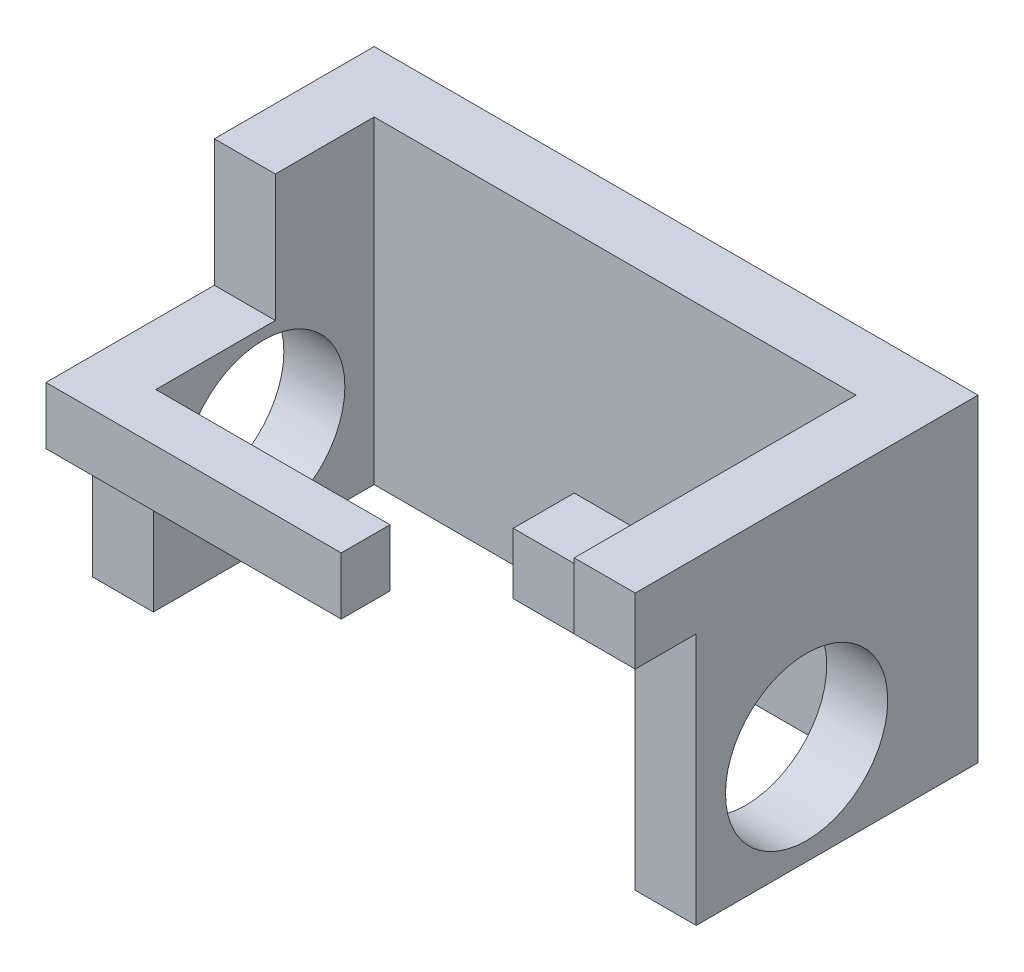
ISO-10303-21;
HEADER;
FILE_DESCRIPTION(('STEP AP214'),'2;1');
FILE_NAME('part.step','',(''),(''),'','','');
FILE_SCHEMA(('AUTOMOTIVE_DESIGN { 1 0 10303 214 1 1 1 1 }'));
ENDSEC;
DATA;
#1=APPLICATION_CONTEXT('core data for automotive mechanical design processes');
#2=APPLICATION_PROTOCOL_DEFINITION('international standard','automotive_design',2000,#1);
#3=PRODUCT_CONTEXT('',#1,'mechanical');
#4=PRODUCT('Part','Part','',(#3));
#5=PRODUCT_RELATED_PRODUCT_CATEGORY('part','',(#4));
#6=PRODUCT_DEFINITION_FORMATION('','',#4);
#7=PRODUCT_DEFINITION_CONTEXT('part definition',#1,'design');
#8=PRODUCT_DEFINITION('design','',#6,#7);
#9=PRODUCT_DEFINITION_SHAPE('','',#8);
#10=(LENGTH_UNIT() NAMED_UNIT(*) SI_UNIT(.MILLI.,.METRE.));
#11=(NAMED_UNIT(*) PLANE_ANGLE_UNIT() SI_UNIT($,.RADIAN.));
#12=(NAMED_UNIT(*) SI_UNIT($,.STERADIAN.) SOLID_ANGLE_UNIT());
#13=UNCERTAINTY_MEASURE_WITH_UNIT(LENGTH_MEASURE(1.E-05),#10,'distance_accuracy_value','');
#14=(GEOMETRIC_REPRESENTATION_CONTEXT(3) GLOBAL_UNCERTAINTY_ASSIGNED_CONTEXT((#13)) GLOBAL_UNIT_ASSIGNED_CONTEXT((#10,
#11,#12)) REPRESENTATION_CONTEXT('',''));
#15=CARTESIAN_POINT('',(0.,0.,0.));
#16=DIRECTION('',(0.,0.,1.));
#17=DIRECTION('',(1.,0.,0.));
#18=AXIS2_PLACEMENT_3D('',#15,#16,#17);
#19=CARTESIAN_POINT('',(-25.3,-45.1648093099041,22.9));
#20=DIRECTION('',(-1.,0.,0.));
#21=DIRECTION('',(0.,0.,1.));
#22=AXIS2_PLACEMENT_3D('',#19,#20,#21);
#23=PLANE('',#22);
#24=DIRECTION('',(0.,0.,1.));
#25=VECTOR('',#24,1.);
#26=CARTESIAN_POINT('',(-25.3,11.,23.1));
#27=LINE('',#26,#25);
#28=CARTESIAN_POINT('',(-25.3,11.,22.9));
#29=VERTEX_POINT('',#28);
#30=CARTESIAN_POINT('',(-25.3,11.,26.9));
#31=VERTEX_POINT('',#30);
#32=EDGE_CURVE('E292',#29,#31,#27,.T.);
#33=ORIENTED_EDGE('',*,*,#32,.F.);
#34=DIRECTION('',(0.,1.,0.));
#35=VECTOR('',#34,1.);
#36=CARTESIAN_POINT('',(-25.3,-45.1648093099041,22.9));
#37=LINE('',#36,#35);
#38=CARTESIAN_POINT('',(-25.3,15.7,22.9));
#39=VERTEX_POINT('',#38);
#40=EDGE_CURVE('E371',#29,#39,#37,.T.);
#41=ORIENTED_EDGE('',*,*,#40,.T.);
#42=DIRECTION('',(0.,0.,-1.));
#43=VECTOR('',#42,1.);
#44=CARTESIAN_POINT('',(-25.3,15.7,26.9));
#45=LINE('',#44,#43);
#46=CARTESIAN_POINT('',(-25.3,15.7,26.9));
#47=VERTEX_POINT('',#46);
#48=EDGE_CURVE('E317',#47,#39,#45,.T.);
#49=ORIENTED_EDGE('',*,*,#48,.F.);
#50=DIRECTION('',(0.,1.,0.));
#51=VECTOR('',#50,1.);
#52=CARTESIAN_POINT('',(-25.3,-45.1648093099041,26.9));
#53=LINE('',#52,#51);
#54=EDGE_CURVE('E353',#31,#47,#53,.T.);
#55=ORIENTED_EDGE('',*,*,#54,.F.);
#56=EDGE_LOOP('',(#33,#41,#49,#55));
#57=FACE_BOUND('',#56,.T.);
#58=ADVANCED_FACE('F39',(#57),#23,.F.);
#59=CARTESIAN_POINT('',(-44.5,-45.1648093099041,22.9));
#60=DIRECTION('',(0.,0.,1.));
#61=DIRECTION('',(1.,0.,0.));
#62=AXIS2_PLACEMENT_3D('',#59,#60,#61);
#63=PLANE('',#62);
#64=DIRECTION('',(-1.,0.,0.));
#65=VECTOR('',#64,1.);
#66=CARTESIAN_POINT('',(0.,11.,22.9));
#67=LINE('',#66,#65);
#68=CARTESIAN_POINT('',(-44.5,11.,22.9));
#69=VERTEX_POINT('',#68);
#70=EDGE_CURVE('E272',#29,#69,#67,.T.);
#71=ORIENTED_EDGE('',*,*,#70,.T.);
#72=DIRECTION('',(0.,1.,0.));
#73=VECTOR('',#72,1.);
#74=CARTESIAN_POINT('',(-44.5,-45.1648093099041,22.9));
#75=LINE('',#74,#73);
#76=CARTESIAN_POINT('',(-44.5,15.7,22.9));
#77=VERTEX_POINT('',#76);
#78=EDGE_CURVE('E359',#69,#77,#75,.T.);
#79=ORIENTED_EDGE('',*,*,#78,.T.);
#80=DIRECTION('',(-1.,0.,0.));
#81=VECTOR('',#80,1.);
#82=CARTESIAN_POINT('',(-25.3,15.7,22.9));
#83=LINE('',#82,#81);
#84=EDGE_CURVE('E321',#39,#77,#83,.T.);
#85=ORIENTED_EDGE('',*,*,#84,.F.);
#86=ORIENTED_EDGE('',*,*,#40,.F.);
#87=EDGE_LOOP('',(#71,#79,#85,#86));
#88=FACE_BOUND('',#87,.T.);
#89=ADVANCED_FACE('F437',(#88),#63,.F.);
#90=CARTESIAN_POINT('',(0.,26.1,26.9));
#91=DIRECTION('',(0.,0.,-1.));
#92=DIRECTION('',(-1.,0.,0.));
#93=AXIS2_PLACEMENT_3D('',#90,#91,#92);
#94=PLANE('',#93);
#95=DIRECTION('',(0.,-1.,0.));
#96=VECTOR('',#95,1.);
#97=CARTESIAN_POINT('',(-49.5,26.1,26.9));
#98=LINE('',#97,#96);
#99=CARTESIAN_POINT('',(-49.5,15.7,26.9));
#100=VERTEX_POINT('',#99);
#101=CARTESIAN_POINT('',(-49.5,11.,26.9));
#102=VERTEX_POINT('',#101);
#103=EDGE_CURVE('E391',#100,#102,#98,.T.);
#104=ORIENTED_EDGE('',*,*,#103,.T.);
#105=DIRECTION('',(-1.,0.,0.));
#106=VECTOR('',#105,1.);
#107=CARTESIAN_POINT('',(-49.5,11.,26.9));
#108=LINE('',#107,#106);
#109=EDGE_CURVE('E276',#31,#102,#108,.T.);
#110=ORIENTED_EDGE('',*,*,#109,.F.);
#111=ORIENTED_EDGE('',*,*,#54,.T.);
#112=DIRECTION('',(1.,0.,0.));
#113=VECTOR('',#112,1.);
#114=CARTESIAN_POINT('',(-49.5,15.7,26.9));
#115=LINE('',#114,#113);
#116=EDGE_CURVE('E313',#100,#47,#115,.T.);
#117=ORIENTED_EDGE('',*,*,#116,.F.);
#118=EDGE_LOOP('',(#104,#110,#111,#117));
#119=FACE_BOUND('',#118,.T.);
#120=ADVANCED_FACE('F427',(#119),#94,.F.);
#121=CARTESIAN_POINT('',(0.,26.1,0.));
#122=DIRECTION('',(-1.,0.,0.));
#123=DIRECTION('',(0.,0.,1.));
#124=AXIS2_PLACEMENT_3D('',#121,#122,#123);
#125=PLANE('',#124);
#126=CARTESIAN_POINT('',(0.,8.15,14.05));
#127=DIRECTION('',(1.,0.,0.));
#128=DIRECTION('',(0.,0.,-1.));
#129=AXIS2_PLACEMENT_3D('',#126,#127,#128);
#130=CIRCLE('',#129,6.65);
#131=CARTESIAN_POINT('',(0.,8.15,7.4));
#132=VERTEX_POINT('',#131);
#133=EDGE_CURVE('E332',#132,#132,#130,.T.);
#134=ORIENTED_EDGE('',*,*,#133,.F.);
#135=EDGE_LOOP('',(#134));
#136=FACE_BOUND('',#135,.T.);
#137=DIRECTION('',(0.,0.,-1.));
#138=VECTOR('',#137,1.);
#139=CARTESIAN_POINT('',(0.,26.1,0.));
#140=LINE('',#139,#138);
#141=CARTESIAN_POINT('',(0.,26.1,28.1));
#142=VERTEX_POINT('',#141);
#143=CARTESIAN_POINT('',(0.,26.1,0.));
#144=VERTEX_POINT('',#143);
#145=EDGE_CURVE('E381',#142,#144,#140,.T.);
#146=ORIENTED_EDGE('',*,*,#145,.F.);
#147=DIRECTION('',(0.,1.,0.));
#148=VECTOR('',#147,1.);
#149=CARTESIAN_POINT('',(0.,20.7,28.1));
#150=LINE('',#149,#148);
#151=CARTESIAN_POINT('',(0.,20.7,28.1));
#152=VERTEX_POINT('',#151);
#153=EDGE_CURVE('E209',#152,#142,#150,.T.);
#154=ORIENTED_EDGE('',*,*,#153,.F.);
#155=DIRECTION('',(0.,0.,1.));
#156=VECTOR('',#155,1.);
#157=CARTESIAN_POINT('',(0.,20.7,26.9));
#158=LINE('',#157,#156);
#159=CARTESIAN_POINT('',(0.,20.7,23.1));
#160=VERTEX_POINT('',#159);
#161=EDGE_CURVE('E258',#160,#152,#158,.T.);
#162=ORIENTED_EDGE('',*,*,#161,.F.);
#163=DIRECTION('',(0.,1.,0.));
#164=VECTOR('',#163,1.);
#165=CARTESIAN_POINT('',(0.,20.7,23.1));
#166=LINE('',#165,#164);
#167=CARTESIAN_POINT('',(0.,0.,23.1));
#168=VERTEX_POINT('',#167);
#169=EDGE_CURVE('E261',#168,#160,#166,.T.);
#170=ORIENTED_EDGE('',*,*,#169,.F.);
#171=DIRECTION('',(0.,0.,-1.));
#172=VECTOR('',#171,1.);
#173=CARTESIAN_POINT('',(0.,0.,0.));
#174=LINE('',#173,#172);
#175=CARTESIAN_POINT('',(0.,0.,0.));
#176=VERTEX_POINT('',#175);
#177=EDGE_CURVE('E380',#168,#176,#174,.T.);
#178=ORIENTED_EDGE('',*,*,#177,.T.);
#179=DIRECTION('',(0.,-1.,0.));
#180=VECTOR('',#179,1.);
#181=CARTESIAN_POINT('',(0.,26.1,0.));
#182=LINE('',#181,#180);
#183=EDGE_CURVE('E11',#144,#176,#182,.T.);
#184=ORIENTED_EDGE('',*,*,#183,.F.);
#185=EDGE_LOOP('',(#146,#154,#162,#170,#178,#184));
#186=FACE_BOUND('',#185,.T.);
#187=ADVANCED_FACE('F41',(#136,#186),#125,.F.);
#188=CARTESIAN_POINT('',(0.,26.1,0.));
#189=DIRECTION('',(0.,0.,1.));
#190=DIRECTION('',(1.,0.,0.));
#191=AXIS2_PLACEMENT_3D('',#188,#189,#190);
#192=PLANE('',#191);
#193=DIRECTION('',(-1.,0.,0.));
#194=VECTOR('',#193,1.);
#195=CARTESIAN_POINT('',(0.,0.,0.));
#196=LINE('',#195,#194);
#197=CARTESIAN_POINT('',(-49.5,0.,0.));
#198=VERTEX_POINT('',#197);
#199=EDGE_CURVE('E394',#176,#198,#196,.T.);
#200=ORIENTED_EDGE('',*,*,#199,.T.);
#201=DIRECTION('',(0.,-1.,0.));
#202=VECTOR('',#201,1.);
#203=CARTESIAN_POINT('',(-49.5,26.1,0.));
#204=LINE('',#203,#202);
#205=CARTESIAN_POINT('',(-49.5,26.1,0.));
#206=VERTEX_POINT('',#205);
#207=EDGE_CURVE('E48',#206,#198,#204,.T.);
#208=ORIENTED_EDGE('',*,*,#207,.F.);
#209=DIRECTION('',(-1.,0.,0.));
#210=VECTOR('',#209,1.);
#211=CARTESIAN_POINT('',(0.,26.1,0.));
#212=LINE('',#211,#210);
#213=EDGE_CURVE('E384',#144,#206,#212,.T.);
#214=ORIENTED_EDGE('',*,*,#213,.F.);
#215=ORIENTED_EDGE('',*,*,#183,.T.);
#216=EDGE_LOOP('',(#200,#208,#214,#215));
#217=FACE_BOUND('',#216,.T.);
#218=ADVANCED_FACE('F445',(#217),#192,.F.);
#219=CARTESIAN_POINT('',(-49.5,26.1,0.));
#220=DIRECTION('',(1.,0.,0.));
#221=DIRECTION('',(0.,0.,-1.));
#222=AXIS2_PLACEMENT_3D('',#219,#220,#221);
#223=PLANE('',#222);
#224=CARTESIAN_POINT('',(-49.5,8.15,14.0500000000007));
#225=DIRECTION('',(1.,0.,0.));
#226=DIRECTION('',(0.,0.,-1.));
#227=AXIS2_PLACEMENT_3D('',#224,#225,#226);
#228=CIRCLE('',#227,6.65);
#229=CARTESIAN_POINT('',(-49.5,8.15,7.40000000000069));
#230=VERTEX_POINT('',#229);
#231=EDGE_CURVE('E190',#230,#230,#228,.F.);
#232=ORIENTED_EDGE('',*,*,#231,.F.);
#233=EDGE_LOOP('',(#232));
#234=FACE_BOUND('',#233,.T.);
#235=DIRECTION('',(0.,-1.,0.));
#236=VECTOR('',#235,1.);
#237=CARTESIAN_POINT('',(-49.5,0.,23.1));
#238=LINE('',#237,#236);
#239=CARTESIAN_POINT('',(-49.5,11.,23.1));
#240=VERTEX_POINT('',#239);
#241=CARTESIAN_POINT('',(-49.5,0.,23.1));
#242=VERTEX_POINT('',#241);
#243=EDGE_CURVE('E282',#240,#242,#238,.T.);
#244=ORIENTED_EDGE('',*,*,#243,.F.);
#245=DIRECTION('',(0.,0.,1.));
#246=VECTOR('',#245,1.);
#247=CARTESIAN_POINT('',(-49.5,11.,23.1));
#248=LINE('',#247,#246);
#249=EDGE_CURVE('E295',#240,#102,#248,.T.);
#250=ORIENTED_EDGE('',*,*,#249,.T.);
#251=ORIENTED_EDGE('',*,*,#103,.F.);
#252=DIRECTION('',(0.,0.,1.));
#253=VECTOR('',#252,1.);
#254=CARTESIAN_POINT('',(-49.5,15.7,13.1));
#255=LINE('',#254,#253);
#256=CARTESIAN_POINT('',(-49.5,15.7,13.1));
#257=VERTEX_POINT('',#256);
#258=EDGE_CURVE('E310',#257,#100,#255,.T.);
#259=ORIENTED_EDGE('',*,*,#258,.F.);
#260=DIRECTION('',(0.,1.,0.));
#261=VECTOR('',#260,1.);
#262=CARTESIAN_POINT('',(-49.5,15.7,13.1));
#263=LINE('',#262,#261);
#264=CARTESIAN_POINT('',(-49.5,26.1,13.1));
#265=VERTEX_POINT('',#264);
#266=EDGE_CURVE('E328',#257,#265,#263,.T.);
#267=ORIENTED_EDGE('',*,*,#266,.T.);
#268=DIRECTION('',(0.,0.,1.));
#269=VECTOR('',#268,1.);
#270=CARTESIAN_POINT('',(-49.5,26.1,0.));
#271=LINE('',#270,#269);
#272=EDGE_CURVE('E388',#206,#265,#271,.T.);
#273=ORIENTED_EDGE('',*,*,#272,.F.);
#274=ORIENTED_EDGE('',*,*,#207,.T.);
#275=DIRECTION('',(0.,0.,1.));
#276=VECTOR('',#275,1.);
#277=CARTESIAN_POINT('',(-49.5,0.,0.));
#278=LINE('',#277,#276);
#279=EDGE_CURVE('E385',#198,#242,#278,.T.);
#280=ORIENTED_EDGE('',*,*,#279,.T.);
#281=EDGE_LOOP('',(#244,#250,#251,#259,#267,#273,#274,#280));
#282=FACE_BOUND('',#281,.T.);
#283=ADVANCED_FACE('F409',(#234,#282),#223,.F.);
#284=CARTESIAN_POINT('',(0.,26.1,0.));
#285=DIRECTION('',(0.,-1.,0.));
#286=DIRECTION('',(0.,0.,-1.));
#287=AXIS2_PLACEMENT_3D('',#284,#285,#286);
#288=PLANE('',#287);
#289=ORIENTED_EDGE('',*,*,#272,.T.);
#290=DIRECTION('',(-1.,0.,0.));
#291=VECTOR('',#290,1.);
#292=CARTESIAN_POINT('',(-44.5,26.1,13.1));
#293=LINE('',#292,#291);
#294=CARTESIAN_POINT('',(-44.5,26.1,13.1));
#295=VERTEX_POINT('',#294);
#296=EDGE_CURVE('E299',#295,#265,#293,.T.);
#297=ORIENTED_EDGE('',*,*,#296,.F.);
#298=DIRECTION('',(0.,0.,1.));
#299=VECTOR('',#298,1.);
#300=CARTESIAN_POINT('',(-44.5,26.1,21.9));
#301=LINE('',#300,#299);
#302=CARTESIAN_POINT('',(-44.5,26.1,5.00000000000001));
#303=VERTEX_POINT('',#302);
#304=EDGE_CURVE('E349',#303,#295,#301,.T.);
#305=ORIENTED_EDGE('',*,*,#304,.F.);
#306=DIRECTION('',(-1.,0.,0.));
#307=VECTOR('',#306,1.);
#308=CARTESIAN_POINT('',(-5.,26.1,5.));
#309=LINE('',#308,#307);
#310=CARTESIAN_POINT('',(-5.,26.1,5.));
#311=VERTEX_POINT('',#310);
#312=EDGE_CURVE('E186',#311,#303,#309,.T.);
#313=ORIENTED_EDGE('',*,*,#312,.F.);
#314=DIRECTION('',(0.,0.,-1.));
#315=VECTOR('',#314,1.);
#316=CARTESIAN_POINT('',(-5.,26.1,21.9));
#317=LINE('',#316,#315);
#318=CARTESIAN_POINT('',(-5.,26.1,28.1));
#319=VERTEX_POINT('',#318);
#320=EDGE_CURVE('E177',#319,#311,#317,.T.);
#321=ORIENTED_EDGE('',*,*,#320,.F.);
#322=DIRECTION('',(-1.,0.,0.));
#323=VECTOR('',#322,1.);
#324=CARTESIAN_POINT('',(0.,26.1,28.1));
#325=LINE('',#324,#323);
#326=EDGE_CURVE('E183',#142,#319,#325,.T.);
#327=ORIENTED_EDGE('',*,*,#326,.F.);
#328=ORIENTED_EDGE('',*,*,#145,.T.);
#329=ORIENTED_EDGE('',*,*,#213,.T.);
#330=EDGE_LOOP('',(#289,#297,#305,#313,#321,#327,#328,#329));
#331=FACE_BOUND('',#330,.T.);
#332=ADVANCED_FACE('F180',(#331),#288,.F.);
#333=CARTESIAN_POINT('',(0.,0.,0.));
#334=DIRECTION('',(0.,-1.,0.));
#335=DIRECTION('',(0.,0.,-1.));
#336=AXIS2_PLACEMENT_3D('',#333,#334,#335);
#337=PLANE('',#336);
#338=DIRECTION('',(1.,0.,0.));
#339=VECTOR('',#338,1.);
#340=CARTESIAN_POINT('',(-49.501,0.,23.1));
#341=LINE('',#340,#339);
#342=CARTESIAN_POINT('',(-5.,0.,23.1));
#343=VERTEX_POINT('',#342);
#344=EDGE_CURVE('E255',#343,#168,#341,.T.);
#345=ORIENTED_EDGE('',*,*,#344,.F.);
#346=DIRECTION('',(0.,0.,-1.));
#347=VECTOR('',#346,1.);
#348=CARTESIAN_POINT('',(-5.,0.,21.9));
#349=LINE('',#348,#347);
#350=CARTESIAN_POINT('',(-5.,0.,5.));
#351=VERTEX_POINT('',#350);
#352=EDGE_CURVE('E366',#343,#351,#349,.T.);
#353=ORIENTED_EDGE('',*,*,#352,.T.);
#354=DIRECTION('',(-1.,0.,0.));
#355=VECTOR('',#354,1.);
#356=CARTESIAN_POINT('',(-5.,0.,5.));
#357=LINE('',#356,#355);
#358=CARTESIAN_POINT('',(-44.5,0.,5.00000000000001));
#359=VERTEX_POINT('',#358);
#360=EDGE_CURVE('E361',#351,#359,#357,.T.);
#361=ORIENTED_EDGE('',*,*,#360,.T.);
#362=DIRECTION('',(0.,0.,1.));
#363=VECTOR('',#362,1.);
#364=CARTESIAN_POINT('',(-44.5,0.,21.9));
#365=LINE('',#364,#363);
#366=CARTESIAN_POINT('',(-44.5,0.,23.1));
#367=VERTEX_POINT('',#366);
#368=EDGE_CURVE('E356',#359,#367,#365,.T.);
#369=ORIENTED_EDGE('',*,*,#368,.T.);
#370=DIRECTION('',(1.,0.,0.));
#371=VECTOR('',#370,1.);
#372=CARTESIAN_POINT('',(-49.5,0.,23.1));
#373=LINE('',#372,#371);
#374=EDGE_CURVE('E285',#242,#367,#373,.T.);
#375=ORIENTED_EDGE('',*,*,#374,.F.);
#376=ORIENTED_EDGE('',*,*,#279,.F.);
#377=ORIENTED_EDGE('',*,*,#199,.F.);
#378=ORIENTED_EDGE('',*,*,#177,.F.);
#379=EDGE_LOOP('',(#345,#353,#361,#369,#375,#376,#377,#378));
#380=FACE_BOUND('',#379,.T.);
#381=ADVANCED_FACE('F415',(#380),#337,.T.);
#382=CARTESIAN_POINT('',(-5.,-45.1648093099041,21.9));
#383=DIRECTION('',(1.,0.,0.));
#384=DIRECTION('',(0.,0.,-1.));
#385=AXIS2_PLACEMENT_3D('',#382,#383,#384);
#386=PLANE('',#385);
#387=DIRECTION('',(0.,-1.,0.));
#388=VECTOR('',#387,1.);
#389=CARTESIAN_POINT('',(-5.,20.7,23.1));
#390=LINE('',#389,#388);
#391=CARTESIAN_POINT('',(-5.,15.7,23.1));
#392=VERTEX_POINT('',#391);
#393=EDGE_CURVE('E269',#392,#343,#390,.T.);
#394=ORIENTED_EDGE('',*,*,#393,.F.);
#395=DIRECTION('',(0.,0.,1.));
#396=VECTOR('',#395,1.);
#397=CARTESIAN_POINT('',(-5.,15.7,18.1));
#398=LINE('',#397,#396);
#399=CARTESIAN_POINT('',(-5.,15.7,18.1));
#400=VERTEX_POINT('',#399);
#401=EDGE_CURVE('E243',#400,#392,#398,.T.);
#402=ORIENTED_EDGE('',*,*,#401,.F.);
#403=DIRECTION('',(0.,1.,0.));
#404=VECTOR('',#403,1.);
#405=CARTESIAN_POINT('',(-5.,20.7,18.1));
#406=LINE('',#405,#404);
#407=CARTESIAN_POINT('',(-5.,20.7,18.1));
#408=VERTEX_POINT('',#407);
#409=EDGE_CURVE('E218',#400,#408,#406,.T.);
#410=ORIENTED_EDGE('',*,*,#409,.T.);
#411=DIRECTION('',(0.,0.,1.));
#412=VECTOR('',#411,1.);
#413=CARTESIAN_POINT('',(-5.,20.7,18.1));
#414=LINE('',#413,#412);
#415=CARTESIAN_POINT('',(-5.,20.7,23.1));
#416=VERTEX_POINT('',#415);
#417=EDGE_CURVE('E234',#408,#416,#414,.T.);
#418=ORIENTED_EDGE('',*,*,#417,.T.);
#419=DIRECTION('',(0.,0.,-1.));
#420=VECTOR('',#419,1.);
#421=CARTESIAN_POINT('',(-5.,20.7,26.9));
#422=LINE('',#421,#420);
#423=CARTESIAN_POINT('',(-5.,20.7,28.1));
#424=VERTEX_POINT('',#423);
#425=EDGE_CURVE('E199',#424,#416,#422,.T.);
#426=ORIENTED_EDGE('',*,*,#425,.F.);
#427=DIRECTION('',(0.,-1.,0.));
#428=VECTOR('',#427,1.);
#429=CARTESIAN_POINT('',(-5.,26.1,28.1));
#430=LINE('',#429,#428);
#431=EDGE_CURVE('E193',#319,#424,#430,.T.);
#432=ORIENTED_EDGE('',*,*,#431,.F.);
#433=ORIENTED_EDGE('',*,*,#320,.T.);
#434=DIRECTION('',(0.,1.,0.));
#435=VECTOR('',#434,1.);
#436=CARTESIAN_POINT('',(-5.,-45.1648093099041,5.));
#437=LINE('',#436,#435);
#438=EDGE_CURVE('E365',#351,#311,#437,.T.);
#439=ORIENTED_EDGE('',*,*,#438,.F.);
#440=ORIENTED_EDGE('',*,*,#352,.F.);
#441=EDGE_LOOP('',(#394,#402,#410,#418,#426,#432,#433,#439,#440));
#442=FACE_BOUND('',#441,.T.);
#443=CARTESIAN_POINT('',(-5.,8.15,14.05));
#444=DIRECTION('',(1.,0.,0.));
#445=DIRECTION('',(0.,0.,-1.));
#446=AXIS2_PLACEMENT_3D('',#443,#444,#445);
#447=CIRCLE('',#446,6.65);
#448=CARTESIAN_POINT('',(-5.,8.15,7.4));
#449=VERTEX_POINT('',#448);
#450=EDGE_CURVE('E338',#449,#449,#447,.F.);
#451=ORIENTED_EDGE('',*,*,#450,.F.);
#452=EDGE_LOOP('',(#451));
#453=FACE_BOUND('',#452,.T.);
#454=ADVANCED_FACE('F195',(#442,#453),#386,.F.);
#455=CARTESIAN_POINT('',(-5.,-45.1648093099041,5.));
#456=DIRECTION('',(0.,0.,-1.));
#457=DIRECTION('',(-1.,0.,0.));
#458=AXIS2_PLACEMENT_3D('',#455,#456,#457);
#459=PLANE('',#458);
#460=ORIENTED_EDGE('',*,*,#438,.T.);
#461=ORIENTED_EDGE('',*,*,#312,.T.);
#462=DIRECTION('',(0.,1.,0.));
#463=VECTOR('',#462,1.);
#464=CARTESIAN_POINT('',(-44.5,-45.1648093099041,5.00000000000001));
#465=LINE('',#464,#463);
#466=EDGE_CURVE('E360',#359,#303,#465,.T.);
#467=ORIENTED_EDGE('',*,*,#466,.F.);
#468=ORIENTED_EDGE('',*,*,#360,.F.);
#469=EDGE_LOOP('',(#460,#461,#467,#468));
#470=FACE_BOUND('',#469,.T.);
#471=ADVANCED_FACE('F453',(#470),#459,.F.);
#472=CARTESIAN_POINT('',(-44.5,-45.1648093099041,21.9));
#473=DIRECTION('',(-1.,0.,0.));
#474=DIRECTION('',(0.,0.,1.));
#475=AXIS2_PLACEMENT_3D('',#472,#473,#474);
#476=PLANE('',#475);
#477=CARTESIAN_POINT('',(-44.5000000000001,8.15,14.0500000000006));
#478=DIRECTION('',(1.,0.,0.));
#479=DIRECTION('',(0.,0.,-1.));
#480=AXIS2_PLACEMENT_3D('',#477,#478,#479);
#481=CIRCLE('',#480,6.65);
#482=CARTESIAN_POINT('',(-44.5000000000002,8.15,7.40000000000062));
#483=VERTEX_POINT('',#482);
#484=EDGE_CURVE('E342',#483,#483,#481,.T.);
#485=ORIENTED_EDGE('',*,*,#484,.F.);
#486=EDGE_LOOP('',(#485));
#487=FACE_BOUND('',#486,.T.);
#488=ORIENTED_EDGE('',*,*,#304,.T.);
#489=DIRECTION('',(0.,1.,0.));
#490=VECTOR('',#489,1.);
#491=CARTESIAN_POINT('',(-44.5,15.7,13.1));
#492=LINE('',#491,#490);
#493=CARTESIAN_POINT('',(-44.5,15.7,13.1));
#494=VERTEX_POINT('',#493);
#495=EDGE_CURVE('E325',#494,#295,#492,.T.);
#496=ORIENTED_EDGE('',*,*,#495,.F.);
#497=DIRECTION('',(0.,0.,-1.));
#498=VECTOR('',#497,1.);
#499=CARTESIAN_POINT('',(-44.5,15.7,22.9));
#500=LINE('',#499,#498);
#501=EDGE_CURVE('E302',#77,#494,#500,.T.);
#502=ORIENTED_EDGE('',*,*,#501,.F.);
#503=ORIENTED_EDGE('',*,*,#78,.F.);
#504=DIRECTION('',(0.,0.,-1.));
#505=VECTOR('',#504,1.);
#506=CARTESIAN_POINT('',(-44.5,11.,45.2278105559497));
#507=LINE('',#506,#505);
#508=CARTESIAN_POINT('',(-44.5,11.,23.1));
#509=VERTEX_POINT('',#508);
#510=EDGE_CURVE('E63',#509,#69,#507,.T.);
#511=ORIENTED_EDGE('',*,*,#510,.F.);
#512=DIRECTION('',(0.,-1.,0.));
#513=VECTOR('',#512,1.);
#514=CARTESIAN_POINT('',(-44.5,0.,23.1));
#515=LINE('',#514,#513);
#516=EDGE_CURVE('E273',#509,#367,#515,.T.);
#517=ORIENTED_EDGE('',*,*,#516,.T.);
#518=ORIENTED_EDGE('',*,*,#368,.F.);
#519=ORIENTED_EDGE('',*,*,#466,.T.);
#520=EDGE_LOOP('',(#488,#496,#502,#503,#511,#517,#518,#519));
#521=FACE_BOUND('',#520,.T.);
#522=ADVANCED_FACE('F440',(#487,#521),#476,.F.);
#523=CARTESIAN_POINT('',(-49.5010000000002,8.15,14.0500000000007));
#524=DIRECTION('',(1.,0.,0.));
#525=DIRECTION('',(0.,0.,-1.));
#526=AXIS2_PLACEMENT_3D('',#523,#524,#525);
#527=CYLINDRICAL_SURFACE('',#526,6.65);
#528=ORIENTED_EDGE('',*,*,#484,.T.);
#529=EDGE_LOOP('',(#528));
#530=FACE_BOUND('',#529,.T.);
#531=ORIENTED_EDGE('',*,*,#231,.T.);
#532=EDGE_LOOP('',(#531));
#533=FACE_BOUND('',#532,.T.);
#534=ADVANCED_FACE('F461',(#530,#533),#527,.F.);
#535=CARTESIAN_POINT('',(-49.501,8.15,14.05));
#536=DIRECTION('',(1.,0.,0.));
#537=DIRECTION('',(0.,0.,-1.));
#538=AXIS2_PLACEMENT_3D('',#535,#536,#537);
#539=CYLINDRICAL_SURFACE('',#538,6.65);
#540=ORIENTED_EDGE('',*,*,#133,.T.);
#541=EDGE_LOOP('',(#540));
#542=FACE_BOUND('',#541,.T.);
#543=ORIENTED_EDGE('',*,*,#450,.T.);
#544=EDGE_LOOP('',(#543));
#545=FACE_BOUND('',#544,.T.);
#546=ADVANCED_FACE('F490',(#542,#545),#539,.F.);
#547=CARTESIAN_POINT('',(-44.5,15.7,13.1));
#548=DIRECTION('',(0.,0.,-1.));
#549=DIRECTION('',(-1.,0.,0.));
#550=AXIS2_PLACEMENT_3D('',#547,#548,#549);
#551=PLANE('',#550);
#552=ORIENTED_EDGE('',*,*,#296,.T.);
#553=ORIENTED_EDGE('',*,*,#266,.F.);
#554=DIRECTION('',(-1.,0.,0.));
#555=VECTOR('',#554,1.);
#556=CARTESIAN_POINT('',(-44.5,15.7,13.1));
#557=LINE('',#556,#555);
#558=EDGE_CURVE('E306',#494,#257,#557,.T.);
#559=ORIENTED_EDGE('',*,*,#558,.F.);
#560=ORIENTED_EDGE('',*,*,#495,.T.);
#561=EDGE_LOOP('',(#552,#553,#559,#560));
#562=FACE_BOUND('',#561,.T.);
#563=ADVANCED_FACE('F443',(#562),#551,.F.);
#564=CARTESIAN_POINT('',(0.,15.7,0.));
#565=DIRECTION('',(0.,1.,0.));
#566=DIRECTION('',(0.,0.,1.));
#567=AXIS2_PLACEMENT_3D('',#564,#565,#566);
#568=PLANE('',#567);
#569=ORIENTED_EDGE('',*,*,#501,.T.);
#570=ORIENTED_EDGE('',*,*,#558,.T.);
#571=ORIENTED_EDGE('',*,*,#258,.T.);
#572=ORIENTED_EDGE('',*,*,#116,.T.);
#573=ORIENTED_EDGE('',*,*,#48,.T.);
#574=ORIENTED_EDGE('',*,*,#84,.T.);
#575=EDGE_LOOP('',(#569,#570,#571,#572,#573,#574));
#576=FACE_BOUND('',#575,.T.);
#577=ADVANCED_FACE('F431',(#576),#568,.T.);
#578=CARTESIAN_POINT('',(-49.5,11.,23.1));
#579=DIRECTION('',(0.,1.,0.));
#580=DIRECTION('',(0.,0.,1.));
#581=AXIS2_PLACEMENT_3D('',#578,#579,#580);
#582=PLANE('',#581);
#583=ORIENTED_EDGE('',*,*,#109,.T.);
#584=ORIENTED_EDGE('',*,*,#249,.F.);
#585=DIRECTION('',(-1.,0.,0.));
#586=VECTOR('',#585,1.);
#587=CARTESIAN_POINT('',(-49.5,11.,23.1));
#588=LINE('',#587,#586);
#589=EDGE_CURVE('E289',#509,#240,#588,.T.);
#590=ORIENTED_EDGE('',*,*,#589,.F.);
#591=ORIENTED_EDGE('',*,*,#510,.T.);
#592=ORIENTED_EDGE('',*,*,#70,.F.);
#593=ORIENTED_EDGE('',*,*,#32,.T.);
#594=EDGE_LOOP('',(#583,#584,#590,#591,#592,#593));
#595=FACE_BOUND('',#594,.T.);
#596=ADVANCED_FACE('F505',(#595),#582,.F.);
#597=CARTESIAN_POINT('',(0.,0.,23.1));
#598=DIRECTION('',(0.,0.,-1.));
#599=DIRECTION('',(-1.,0.,0.));
#600=AXIS2_PLACEMENT_3D('',#597,#598,#599);
#601=PLANE('',#600);
#602=ORIENTED_EDGE('',*,*,#374,.T.);
#603=ORIENTED_EDGE('',*,*,#516,.F.);
#604=ORIENTED_EDGE('',*,*,#589,.T.);
#605=ORIENTED_EDGE('',*,*,#243,.T.);
#606=EDGE_LOOP('',(#602,#603,#604,#605));
#607=FACE_BOUND('',#606,.T.);
#608=ADVANCED_FACE('F418',(#607),#601,.F.);
#609=CARTESIAN_POINT('',(-49.501,20.7,26.9));
#610=DIRECTION('',(0.,1.,0.));
#611=DIRECTION('',(0.,0.,1.));
#612=AXIS2_PLACEMENT_3D('',#609,#610,#611);
#613=PLANE('',#612);
#614=ORIENTED_EDGE('',*,*,#425,.T.);
#615=DIRECTION('',(1.,0.,0.));
#616=VECTOR('',#615,1.);
#617=CARTESIAN_POINT('',(-49.501,20.7,23.1));
#618=LINE('',#617,#616);
#619=EDGE_CURVE('E246',#416,#160,#618,.T.);
#620=ORIENTED_EDGE('',*,*,#619,.T.);
#621=ORIENTED_EDGE('',*,*,#161,.T.);
#622=DIRECTION('',(1.,0.,0.));
#623=VECTOR('',#622,1.);
#624=CARTESIAN_POINT('',(-5.,20.7,28.1));
#625=LINE('',#624,#623);
#626=EDGE_CURVE('E204',#424,#152,#625,.T.);
#627=ORIENTED_EDGE('',*,*,#626,.F.);
#628=EDGE_LOOP('',(#614,#620,#621,#627));
#629=FACE_BOUND('',#628,.T.);
#630=ADVANCED_FACE('F510',(#629),#613,.F.);
#631=CARTESIAN_POINT('',(-49.501,20.7,23.1));
#632=DIRECTION('',(0.,0.,-1.));
#633=DIRECTION('',(-1.,0.,0.));
#634=AXIS2_PLACEMENT_3D('',#631,#632,#633);
#635=PLANE('',#634);
#636=ORIENTED_EDGE('',*,*,#619,.F.);
#637=DIRECTION('',(-1.,0.,0.));
#638=VECTOR('',#637,1.);
#639=CARTESIAN_POINT('',(-15.,20.7,23.1));
#640=LINE('',#639,#638);
#641=CARTESIAN_POINT('',(-15.,20.7,23.1));
#642=VERTEX_POINT('',#641);
#643=EDGE_CURVE('E217',#416,#642,#640,.T.);
#644=ORIENTED_EDGE('',*,*,#643,.T.);
#645=DIRECTION('',(0.,-1.,0.));
#646=VECTOR('',#645,1.);
#647=CARTESIAN_POINT('',(-15.,20.7,23.1));
#648=LINE('',#647,#646);
#649=CARTESIAN_POINT('',(-15.,15.7,23.1));
#650=VERTEX_POINT('',#649);
#651=EDGE_CURVE('E238',#642,#650,#648,.T.);
#652=ORIENTED_EDGE('',*,*,#651,.T.);
#653=DIRECTION('',(1.,0.,0.));
#654=VECTOR('',#653,1.);
#655=CARTESIAN_POINT('',(-15.,15.7,23.1));
#656=LINE('',#655,#654);
#657=EDGE_CURVE('E55',#650,#392,#656,.T.);
#658=ORIENTED_EDGE('',*,*,#657,.T.);
#659=ORIENTED_EDGE('',*,*,#393,.T.);
#660=ORIENTED_EDGE('',*,*,#344,.T.);
#661=ORIENTED_EDGE('',*,*,#169,.T.);
#662=EDGE_LOOP('',(#636,#644,#652,#658,#659,#660,#661));
#663=FACE_BOUND('',#662,.T.);
#664=ADVANCED_FACE('F511',(#663),#635,.F.);
#665=CARTESIAN_POINT('',(-15.,15.7,18.1));
#666=DIRECTION('',(0.,-1.,0.));
#667=DIRECTION('',(0.,0.,-1.));
#668=AXIS2_PLACEMENT_3D('',#665,#666,#667);
#669=PLANE('',#668);
#670=ORIENTED_EDGE('',*,*,#657,.F.);
#671=DIRECTION('',(0.,0.,1.));
#672=VECTOR('',#671,1.);
#673=CARTESIAN_POINT('',(-15.,15.7,18.1));
#674=LINE('',#673,#672);
#675=CARTESIAN_POINT('',(-15.,15.7,18.1));
#676=VERTEX_POINT('',#675);
#677=EDGE_CURVE('E247',#676,#650,#674,.T.);
#678=ORIENTED_EDGE('',*,*,#677,.F.);
#679=DIRECTION('',(1.,0.,0.));
#680=VECTOR('',#679,1.);
#681=CARTESIAN_POINT('',(-15.,15.7,18.1));
#682=LINE('',#681,#680);
#683=EDGE_CURVE('E230',#676,#400,#682,.T.);
#684=ORIENTED_EDGE('',*,*,#683,.T.);
#685=ORIENTED_EDGE('',*,*,#401,.T.);
#686=EDGE_LOOP('',(#670,#678,#684,#685));
#687=FACE_BOUND('',#686,.T.);
#688=ADVANCED_FACE('F514',(#687),#669,.T.);
#689=CARTESIAN_POINT('',(-15.,20.7,18.1));
#690=DIRECTION('',(-1.,0.,0.));
#691=DIRECTION('',(0.,-1.,0.));
#692=AXIS2_PLACEMENT_3D('',#689,#690,#691);
#693=PLANE('',#692);
#694=ORIENTED_EDGE('',*,*,#651,.F.);
#695=DIRECTION('',(0.,0.,1.));
#696=VECTOR('',#695,1.);
#697=CARTESIAN_POINT('',(-15.,20.7,18.1));
#698=LINE('',#697,#696);
#699=CARTESIAN_POINT('',(-15.,20.7,18.1));
#700=VERTEX_POINT('',#699);
#701=EDGE_CURVE('E250',#700,#642,#698,.T.);
#702=ORIENTED_EDGE('',*,*,#701,.F.);
#703=DIRECTION('',(0.,-1.,0.));
#704=VECTOR('',#703,1.);
#705=CARTESIAN_POINT('',(-15.,20.7,18.1));
#706=LINE('',#705,#704);
#707=EDGE_CURVE('E226',#700,#676,#706,.T.);
#708=ORIENTED_EDGE('',*,*,#707,.T.);
#709=ORIENTED_EDGE('',*,*,#677,.T.);
#710=EDGE_LOOP('',(#694,#702,#708,#709));
#711=FACE_BOUND('',#710,.T.);
#712=ADVANCED_FACE('F522',(#711),#693,.T.);
#713=CARTESIAN_POINT('',(-15.,20.7,18.1));
#714=DIRECTION('',(0.,1.,0.));
#715=DIRECTION('',(0.,0.,1.));
#716=AXIS2_PLACEMENT_3D('',#713,#714,#715);
#717=PLANE('',#716);
#718=ORIENTED_EDGE('',*,*,#643,.F.);
#719=ORIENTED_EDGE('',*,*,#417,.F.);
#720=DIRECTION('',(-1.,0.,0.));
#721=VECTOR('',#720,1.);
#722=CARTESIAN_POINT('',(-15.,20.7,18.1));
#723=LINE('',#722,#721);
#724=EDGE_CURVE('E222',#408,#700,#723,.T.);
#725=ORIENTED_EDGE('',*,*,#724,.T.);
#726=ORIENTED_EDGE('',*,*,#701,.T.);
#727=EDGE_LOOP('',(#718,#719,#725,#726));
#728=FACE_BOUND('',#727,.T.);
#729=ADVANCED_FACE('F518',(#728),#717,.T.);
#730=CARTESIAN_POINT('',(0.,0.,18.1));
#731=DIRECTION('',(0.,0.,1.));
#732=DIRECTION('',(1.,0.,0.));
#733=AXIS2_PLACEMENT_3D('',#730,#731,#732);
#734=PLANE('',#733);
#735=ORIENTED_EDGE('',*,*,#409,.F.);
#736=ORIENTED_EDGE('',*,*,#683,.F.);
#737=ORIENTED_EDGE('',*,*,#707,.F.);
#738=ORIENTED_EDGE('',*,*,#724,.F.);
#739=EDGE_LOOP('',(#735,#736,#737,#738));
#740=FACE_BOUND('',#739,.T.);
#741=ADVANCED_FACE('F521',(#740),#734,.F.);
#742=CARTESIAN_POINT('',(0.,0.,28.1));
#743=DIRECTION('',(0.,0.,1.));
#744=DIRECTION('',(1.,0.,0.));
#745=AXIS2_PLACEMENT_3D('',#742,#743,#744);
#746=PLANE('',#745);
#747=ORIENTED_EDGE('',*,*,#326,.T.);
#748=ORIENTED_EDGE('',*,*,#431,.T.);
#749=ORIENTED_EDGE('',*,*,#626,.T.);
#750=ORIENTED_EDGE('',*,*,#153,.T.);
#751=EDGE_LOOP('',(#747,#748,#749,#750));
#752=FACE_BOUND('',#751,.T.);
#753=ADVANCED_FACE('F207',(#752),#746,.T.);
#754=CLOSED_SHELL('',(#58,#89,#120,#187,#218,#283,#332,#381,#454,#471,#522,#534,#546,#563,#577,
#596,#608,#630,#664,#688,#712,#729,#741,#753));
#755=MANIFOLD_SOLID_BREP('B2',#754);
#756=ADVANCED_BREP_SHAPE_REPRESENTATION('',(#18,#755),#14);
#757=SHAPE_DEFINITION_REPRESENTATION(#9,#756);
ENDSEC;
END-ISO-10303-21;
